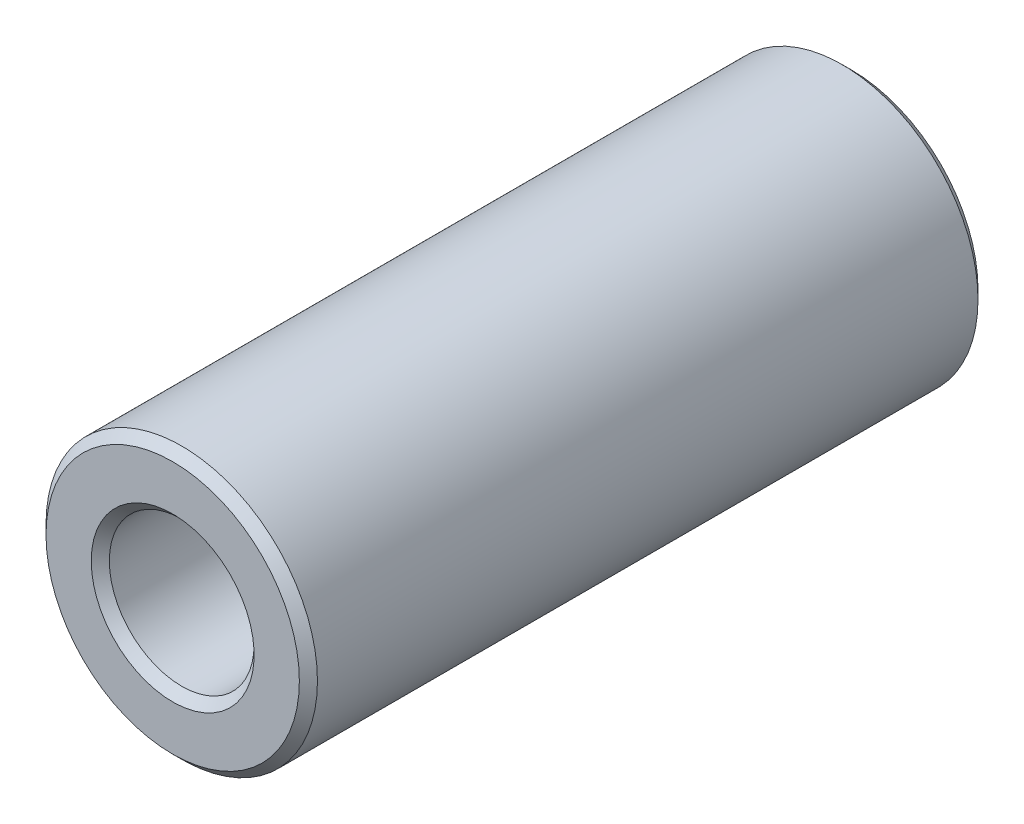
ISO-10303-21;
HEADER;
FILE_DESCRIPTION(('STEP AP214'),'2;1');
FILE_NAME('part.step','',(''),(''),'','','');
FILE_SCHEMA(('AUTOMOTIVE_DESIGN { 1 0 10303 214 1 1 1 1 }'));
ENDSEC;
DATA;
#1=APPLICATION_CONTEXT('core data for automotive mechanical design processes');
#2=APPLICATION_PROTOCOL_DEFINITION('international standard','automotive_design',2000,#1);
#3=PRODUCT_CONTEXT('',#1,'mechanical');
#4=PRODUCT('Part','Part','',(#3));
#5=PRODUCT_RELATED_PRODUCT_CATEGORY('part','',(#4));
#6=PRODUCT_DEFINITION_FORMATION('','',#4);
#7=PRODUCT_DEFINITION_CONTEXT('part definition',#1,'design');
#8=PRODUCT_DEFINITION('design','',#6,#7);
#9=PRODUCT_DEFINITION_SHAPE('','',#8);
#10=(LENGTH_UNIT() NAMED_UNIT(*) SI_UNIT(.MILLI.,.METRE.));
#11=(NAMED_UNIT(*) PLANE_ANGLE_UNIT() SI_UNIT($,.RADIAN.));
#12=(NAMED_UNIT(*) SI_UNIT($,.STERADIAN.) SOLID_ANGLE_UNIT());
#13=UNCERTAINTY_MEASURE_WITH_UNIT(LENGTH_MEASURE(1.E-05),#10,'distance_accuracy_value','');
#14=(GEOMETRIC_REPRESENTATION_CONTEXT(3) GLOBAL_UNCERTAINTY_ASSIGNED_CONTEXT((#13)) GLOBAL_UNIT_ASSIGNED_CONTEXT((#10,
#11,#12)) REPRESENTATION_CONTEXT('',''));
#15=CARTESIAN_POINT('',(0.,0.,0.));
#16=DIRECTION('',(0.,0.,1.));
#17=DIRECTION('',(1.,0.,0.));
#18=AXIS2_PLACEMENT_3D('',#15,#16,#17);
#19=CARTESIAN_POINT('',(0.,3.,7.5));
#20=DIRECTION('',(0.,0.,-1.));
#21=DIRECTION('',(-1.,0.,0.));
#22=AXIS2_PLACEMENT_3D('',#19,#20,#21);
#23=PLANE('',#22);
#24=CARTESIAN_POINT('',(0.,0.,7.5));
#25=DIRECTION('',(0.,0.,-1.));
#26=DIRECTION('',(-1.,0.,0.));
#27=AXIS2_PLACEMENT_3D('',#24,#25,#26);
#28=CIRCLE('',#27,1.8);
#29=CARTESIAN_POINT('',(-1.8,0.,7.5));
#30=VERTEX_POINT('',#29);
#31=EDGE_CURVE('E61',#30,#30,#28,.T.);
#32=ORIENTED_EDGE('',*,*,#31,.T.);
#33=EDGE_LOOP('',(#32));
#34=FACE_BOUND('',#33,.T.);
#35=CARTESIAN_POINT('',(0.,0.,7.5));
#36=DIRECTION('',(0.,0.,-1.));
#37=DIRECTION('',(-1.,0.,0.));
#38=AXIS2_PLACEMENT_3D('',#35,#36,#37);
#39=CIRCLE('',#38,2.79999999999999);
#40=CARTESIAN_POINT('',(-2.79999999999999,0.,7.5));
#41=VERTEX_POINT('',#40);
#42=EDGE_CURVE('E64',#41,#41,#39,.F.);
#43=ORIENTED_EDGE('',*,*,#42,.T.);
#44=EDGE_LOOP('',(#43));
#45=FACE_BOUND('',#44,.T.);
#46=ADVANCED_FACE('F40',(#34,#45),#23,.F.);
#47=CARTESIAN_POINT('',(0.,0.,7.12809917355371));
#48=DIRECTION('',(0.,0.,1.));
#49=DIRECTION('',(1.,0.,0.));
#50=AXIS2_PLACEMENT_3D('',#47,#48,#49);
#51=CYLINDRICAL_SURFACE('',#50,1.6);
#52=CARTESIAN_POINT('',(0.,0.,7.3));
#53=DIRECTION('',(0.,0.,-1.));
#54=DIRECTION('',(-1.,0.,0.));
#55=AXIS2_PLACEMENT_3D('',#52,#53,#54);
#56=CIRCLE('',#55,1.6);
#57=CARTESIAN_POINT('',(-1.6,0.,7.3));
#58=VERTEX_POINT('',#57);
#59=EDGE_CURVE('E67',#58,#58,#56,.F.);
#60=ORIENTED_EDGE('',*,*,#59,.T.);
#61=EDGE_LOOP('',(#60));
#62=FACE_BOUND('',#61,.T.);
#63=CARTESIAN_POINT('',(0.,0.,-7.3));
#64=DIRECTION('',(0.,0.,1.));
#65=DIRECTION('',(1.,0.,0.));
#66=AXIS2_PLACEMENT_3D('',#63,#64,#65);
#67=CIRCLE('',#66,1.6);
#68=CARTESIAN_POINT('',(1.6,0.,-7.3));
#69=VERTEX_POINT('',#68);
#70=EDGE_CURVE('E70',#69,#69,#67,.F.);
#71=ORIENTED_EDGE('',*,*,#70,.T.);
#72=EDGE_LOOP('',(#71));
#73=FACE_BOUND('',#72,.T.);
#74=ADVANCED_FACE('F74',(#62,#73),#51,.F.);
#75=CARTESIAN_POINT('',(0.,3.,-7.5));
#76=DIRECTION('',(0.,0.,1.));
#77=DIRECTION('',(1.,0.,0.));
#78=AXIS2_PLACEMENT_3D('',#75,#76,#77);
#79=PLANE('',#78);
#80=CARTESIAN_POINT('',(0.,0.,-7.5));
#81=DIRECTION('',(0.,0.,1.));
#82=DIRECTION('',(1.,0.,0.));
#83=AXIS2_PLACEMENT_3D('',#80,#81,#82);
#84=CIRCLE('',#83,1.8);
#85=CARTESIAN_POINT('',(1.8,0.,-7.5));
#86=VERTEX_POINT('',#85);
#87=EDGE_CURVE('E52',#86,#86,#84,.T.);
#88=ORIENTED_EDGE('',*,*,#87,.T.);
#89=EDGE_LOOP('',(#88));
#90=FACE_BOUND('',#89,.T.);
#91=CARTESIAN_POINT('',(0.,0.,-7.5));
#92=DIRECTION('',(0.,0.,1.));
#93=DIRECTION('',(1.,0.,0.));
#94=AXIS2_PLACEMENT_3D('',#91,#92,#93);
#95=CIRCLE('',#94,2.8);
#96=CARTESIAN_POINT('',(2.8,0.,-7.5));
#97=VERTEX_POINT('',#96);
#98=EDGE_CURVE('E56',#97,#97,#95,.F.);
#99=ORIENTED_EDGE('',*,*,#98,.T.);
#100=EDGE_LOOP('',(#99));
#101=FACE_BOUND('',#100,.T.);
#102=ADVANCED_FACE('F84',(#90,#101),#79,.F.);
#103=CARTESIAN_POINT('',(0.,0.,7.12809917355371));
#104=DIRECTION('',(0.,0.,1.));
#105=DIRECTION('',(1.,0.,0.));
#106=AXIS2_PLACEMENT_3D('',#103,#104,#105);
#107=CYLINDRICAL_SURFACE('',#106,3.);
#108=CARTESIAN_POINT('',(0.,0.,-7.3));
#109=DIRECTION('',(0.,0.,1.));
#110=DIRECTION('',(1.,0.,0.));
#111=AXIS2_PLACEMENT_3D('',#108,#109,#110);
#112=CIRCLE('',#111,3.);
#113=CARTESIAN_POINT('',(3.,0.,-7.3));
#114=VERTEX_POINT('',#113);
#115=EDGE_CURVE('E10',#114,#114,#112,.T.);
#116=ORIENTED_EDGE('',*,*,#115,.T.);
#117=EDGE_LOOP('',(#116));
#118=FACE_BOUND('',#117,.T.);
#119=CARTESIAN_POINT('',(0.,0.,7.29999999999999));
#120=DIRECTION('',(0.,0.,-1.));
#121=DIRECTION('',(-1.,0.,0.));
#122=AXIS2_PLACEMENT_3D('',#119,#120,#121);
#123=CIRCLE('',#122,3.);
#124=CARTESIAN_POINT('',(-3.,0.,7.29999999999999));
#125=VERTEX_POINT('',#124);
#126=EDGE_CURVE('E48',#125,#125,#123,.T.);
#127=ORIENTED_EDGE('',*,*,#126,.T.);
#128=EDGE_LOOP('',(#127));
#129=FACE_BOUND('',#128,.T.);
#130=ADVANCED_FACE('F87',(#118,#129),#107,.T.);
#131=CARTESIAN_POINT('',(0.,0.,7.3));
#132=DIRECTION('',(0.,0.,1.));
#133=DIRECTION('',(1.,0.,0.));
#134=AXIS2_PLACEMENT_3D('',#131,#132,#133);
#135=CONICAL_SURFACE('',#134,1.6,0.785398163397448);
#136=ORIENTED_EDGE('',*,*,#31,.F.);
#137=EDGE_LOOP('',(#136));
#138=FACE_BOUND('',#137,.T.);
#139=ORIENTED_EDGE('',*,*,#59,.F.);
#140=EDGE_LOOP('',(#139));
#141=FACE_BOUND('',#140,.T.);
#142=ADVANCED_FACE('F80',(#138,#141),#135,.F.);
#143=CARTESIAN_POINT('',(0.,0.,-7.5));
#144=DIRECTION('',(0.,0.,-1.));
#145=DIRECTION('',(-1.,0.,0.));
#146=AXIS2_PLACEMENT_3D('',#143,#144,#145);
#147=CONICAL_SURFACE('',#146,1.8,0.785398163397448);
#148=ORIENTED_EDGE('',*,*,#70,.F.);
#149=EDGE_LOOP('',(#148));
#150=FACE_BOUND('',#149,.T.);
#151=ORIENTED_EDGE('',*,*,#87,.F.);
#152=EDGE_LOOP('',(#151));
#153=FACE_BOUND('',#152,.T.);
#154=ADVANCED_FACE('F76',(#150,#153),#147,.F.);
#155=CARTESIAN_POINT('',(0.,0.,-7.3));
#156=DIRECTION('',(0.,0.,1.));
#157=DIRECTION('',(1.,0.,0.));
#158=AXIS2_PLACEMENT_3D('',#155,#156,#157);
#159=CONICAL_SURFACE('',#158,3.,0.785398163397447);
#160=ORIENTED_EDGE('',*,*,#98,.F.);
#161=EDGE_LOOP('',(#160));
#162=FACE_BOUND('',#161,.T.);
#163=ORIENTED_EDGE('',*,*,#115,.F.);
#164=EDGE_LOOP('',(#163));
#165=FACE_BOUND('',#164,.T.);
#166=ADVANCED_FACE('F79',(#162,#165),#159,.T.);
#167=CARTESIAN_POINT('',(0.,0.,7.5));
#168=DIRECTION('',(0.,0.,-1.));
#169=DIRECTION('',(-1.,0.,0.));
#170=AXIS2_PLACEMENT_3D('',#167,#168,#169);
#171=CONICAL_SURFACE('',#170,2.79999999999999,0.785398163397445);
#172=ORIENTED_EDGE('',*,*,#126,.F.);
#173=EDGE_LOOP('',(#172));
#174=FACE_BOUND('',#173,.T.);
#175=ORIENTED_EDGE('',*,*,#42,.F.);
#176=EDGE_LOOP('',(#175));
#177=FACE_BOUND('',#176,.T.);
#178=ADVANCED_FACE('F43',(#174,#177),#171,.T.);
#179=CLOSED_SHELL('',(#46,#74,#102,#130,#142,#154,#166,#178));
#180=MANIFOLD_SOLID_BREP('B2',#179);
#181=ADVANCED_BREP_SHAPE_REPRESENTATION('',(#18,#180),#14);
#182=SHAPE_DEFINITION_REPRESENTATION(#9,#181);
ENDSEC;
END-ISO-10303-21;
